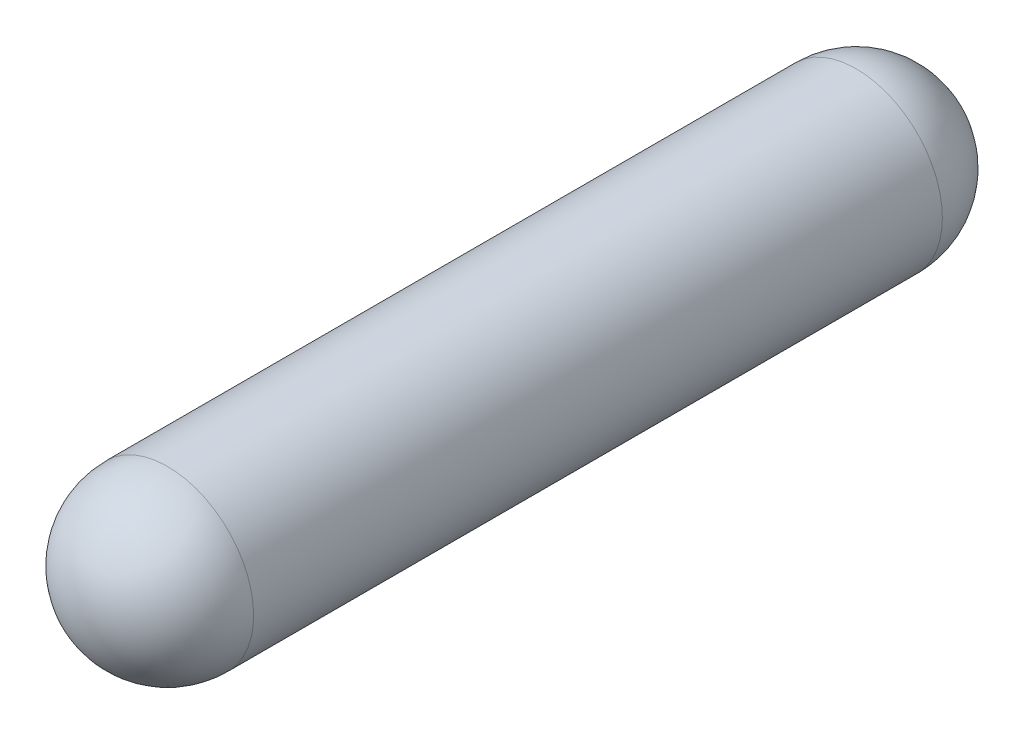
ISO-10303-21;
HEADER;
FILE_DESCRIPTION(('STEP AP214'),'2;1');
FILE_NAME('part.step','',(''),(''),'','','');
FILE_SCHEMA(('AUTOMOTIVE_DESIGN { 1 0 10303 214 1 1 1 1 }'));
ENDSEC;
DATA;
#1=APPLICATION_CONTEXT('core data for automotive mechanical design processes');
#2=APPLICATION_PROTOCOL_DEFINITION('international standard','automotive_design',2000,#1);
#3=PRODUCT_CONTEXT('',#1,'mechanical');
#4=PRODUCT('Part','Part','',(#3));
#5=PRODUCT_RELATED_PRODUCT_CATEGORY('part','',(#4));
#6=PRODUCT_DEFINITION_FORMATION('','',#4);
#7=PRODUCT_DEFINITION_CONTEXT('part definition',#1,'design');
#8=PRODUCT_DEFINITION('design','',#6,#7);
#9=PRODUCT_DEFINITION_SHAPE('','',#8);
#10=(LENGTH_UNIT() NAMED_UNIT(*) SI_UNIT(.MILLI.,.METRE.));
#11=(NAMED_UNIT(*) PLANE_ANGLE_UNIT() SI_UNIT($,.RADIAN.));
#12=(NAMED_UNIT(*) SI_UNIT($,.STERADIAN.) SOLID_ANGLE_UNIT());
#13=UNCERTAINTY_MEASURE_WITH_UNIT(LENGTH_MEASURE(1.E-05),#10,'distance_accuracy_value','');
#14=(GEOMETRIC_REPRESENTATION_CONTEXT(3) GLOBAL_UNCERTAINTY_ASSIGNED_CONTEXT((#13)) GLOBAL_UNIT_ASSIGNED_CONTEXT((#10,
#11,#12)) REPRESENTATION_CONTEXT('',''));
#15=CARTESIAN_POINT('',(0.,0.,0.));
#16=DIRECTION('',(0.,0.,1.));
#17=DIRECTION('',(1.,0.,0.));
#18=AXIS2_PLACEMENT_3D('',#15,#16,#17);
#19=CARTESIAN_POINT('',(0.,0.,-1.2));
#20=DIRECTION('',(0.,0.,1.));
#21=DIRECTION('',(1.,0.,0.));
#22=AXIS2_PLACEMENT_3D('',#19,#20,#21);
#23=CYLINDRICAL_SURFACE('',#22,0.3);
#24=CARTESIAN_POINT('',(0.,0.,-1.2));
#25=DIRECTION('',(0.,0.,1.));
#26=DIRECTION('',(1.,0.,0.));
#27=AXIS2_PLACEMENT_3D('',#24,#25,#26);
#28=CIRCLE('',#27,0.3);
#29=CARTESIAN_POINT('',(0.3,0.,-1.2));
#30=VERTEX_POINT('',#29);
#31=EDGE_CURVE('E10',#30,#30,#28,.T.);
#32=ORIENTED_EDGE('',*,*,#31,.T.);
#33=EDGE_LOOP('',(#32));
#34=FACE_BOUND('',#33,.T.);
#35=CARTESIAN_POINT('',(0.,0.,1.2));
#36=DIRECTION('',(0.,0.,1.));
#37=DIRECTION('',(1.,0.,0.));
#38=AXIS2_PLACEMENT_3D('',#35,#36,#37);
#39=CIRCLE('',#38,0.3);
#40=CARTESIAN_POINT('',(0.3,0.,1.2));
#41=VERTEX_POINT('',#40);
#42=EDGE_CURVE('E38',#41,#41,#39,.T.);
#43=ORIENTED_EDGE('',*,*,#42,.F.);
#44=EDGE_LOOP('',(#43));
#45=FACE_BOUND('',#44,.T.);
#46=ADVANCED_FACE('F31',(#34,#45),#23,.T.);
#47=CARTESIAN_POINT('',(0.,0.,-1.2));
#48=DIRECTION('',(0.,0.,1.));
#49=DIRECTION('',(1.,0.,0.));
#50=AXIS2_PLACEMENT_3D('',#47,#48,#49);
#51=SPHERICAL_SURFACE('',#50,0.3);
#52=ORIENTED_EDGE('',*,*,#31,.F.);
#53=EDGE_LOOP('',(#52));
#54=FACE_BOUND('',#53,.T.);
#55=ADVANCED_FACE('F33',(#54),#51,.T.);
#56=CARTESIAN_POINT('',(0.,0.,1.2));
#57=DIRECTION('',(0.,0.,1.));
#58=DIRECTION('',(1.,0.,0.));
#59=AXIS2_PLACEMENT_3D('',#56,#57,#58);
#60=SPHERICAL_SURFACE('',#59,0.3);
#61=ORIENTED_EDGE('',*,*,#42,.T.);
#62=EDGE_LOOP('',(#61));
#63=FACE_BOUND('',#62,.T.);
#64=ADVANCED_FACE('F44',(#63),#60,.T.);
#65=CLOSED_SHELL('',(#46,#55,#64));
#66=MANIFOLD_SOLID_BREP('B2',#65);
#67=ADVANCED_BREP_SHAPE_REPRESENTATION('',(#18,#66),#14);
#68=SHAPE_DEFINITION_REPRESENTATION(#9,#67);
ENDSEC;
END-ISO-10303-21;
